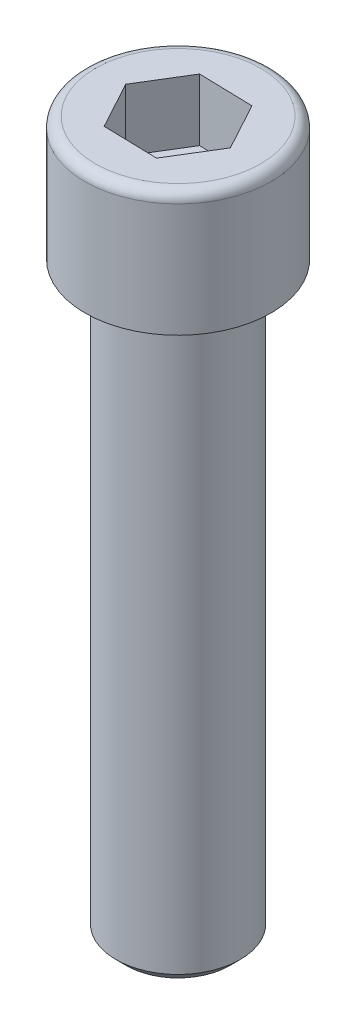
ISO-10303-21;
HEADER;
FILE_DESCRIPTION(('STEP AP214'),'2;1');
FILE_NAME('part.step','',(''),(''),'','','');
FILE_SCHEMA(('AUTOMOTIVE_DESIGN { 1 0 10303 214 1 1 1 1 }'));
ENDSEC;
DATA;
#1=APPLICATION_CONTEXT('core data for automotive mechanical design processes');
#2=APPLICATION_PROTOCOL_DEFINITION('international standard','automotive_design',2000,#1);
#3=PRODUCT_CONTEXT('',#1,'mechanical');
#4=PRODUCT('Part','Part','',(#3));
#5=PRODUCT_RELATED_PRODUCT_CATEGORY('part','',(#4));
#6=PRODUCT_DEFINITION_FORMATION('','',#4);
#7=PRODUCT_DEFINITION_CONTEXT('part definition',#1,'design');
#8=PRODUCT_DEFINITION('design','',#6,#7);
#9=PRODUCT_DEFINITION_SHAPE('','',#8);
#10=(LENGTH_UNIT() NAMED_UNIT(*) SI_UNIT(.MILLI.,.METRE.));
#11=(NAMED_UNIT(*) PLANE_ANGLE_UNIT() SI_UNIT($,.RADIAN.));
#12=(NAMED_UNIT(*) SI_UNIT($,.STERADIAN.) SOLID_ANGLE_UNIT());
#13=UNCERTAINTY_MEASURE_WITH_UNIT(LENGTH_MEASURE(1.E-05),#10,'distance_accuracy_value','');
#14=(GEOMETRIC_REPRESENTATION_CONTEXT(3) GLOBAL_UNCERTAINTY_ASSIGNED_CONTEXT((#13)) GLOBAL_UNIT_ASSIGNED_CONTEXT((#10,
#11,#12)) REPRESENTATION_CONTEXT('',''));
#15=CARTESIAN_POINT('',(0.,0.,0.));
#16=DIRECTION('',(0.,0.,1.));
#17=DIRECTION('',(1.,0.,0.));
#18=AXIS2_PLACEMENT_3D('',#15,#16,#17);
#19=CARTESIAN_POINT('',(0.,36.,0.));
#20=DIRECTION('',(0.,-1.,0.));
#21=DIRECTION('',(0.,0.,-1.));
#22=AXIS2_PLACEMENT_3D('',#19,#20,#21);
#23=CYLINDRICAL_SURFACE('',#22,27.);
#24=CARTESIAN_POINT('',(0.,33.,0.));
#25=DIRECTION('',(0.,1.,0.));
#26=DIRECTION('',(0.,0.,1.));
#27=AXIS2_PLACEMENT_3D('',#24,#25,#26);
#28=CIRCLE('',#27,27.);
#29=CARTESIAN_POINT('',(0.,33.,27.));
#30=VERTEX_POINT('',#29);
#31=EDGE_CURVE('E147',#30,#30,#28,.F.);
#32=ORIENTED_EDGE('',*,*,#31,.T.);
#33=EDGE_LOOP('',(#32));
#34=FACE_BOUND('',#33,.T.);
#35=CARTESIAN_POINT('',(0.,0.,0.));
#36=DIRECTION('',(0.,1.,0.));
#37=DIRECTION('',(0.,0.,1.));
#38=AXIS2_PLACEMENT_3D('',#35,#36,#37);
#39=CIRCLE('',#38,27.);
#40=CARTESIAN_POINT('',(0.,0.,27.));
#41=VERTEX_POINT('',#40);
#42=EDGE_CURVE('E138',#41,#41,#39,.T.);
#43=ORIENTED_EDGE('',*,*,#42,.T.);
#44=EDGE_LOOP('',(#43));
#45=FACE_BOUND('',#44,.T.);
#46=ADVANCED_FACE('F36',(#34,#45),#23,.T.);
#47=CARTESIAN_POINT('',(0.,36.,0.));
#48=DIRECTION('',(0.,1.,0.));
#49=DIRECTION('',(0.,0.,1.));
#50=AXIS2_PLACEMENT_3D('',#47,#48,#49);
#51=PLANE('',#50);
#52=DIRECTION('',(-0.477309128780898,0.,-0.878735452558061));
#53=VECTOR('',#52,1.);
#54=CARTESIAN_POINT('',(15.5831850883761,36.,0.405391787549548));
#55=LINE('',#54,#53);
#56=CARTESIAN_POINT('',(15.5831850883761,36.,0.405391787549548));
#57=VERTEX_POINT('',#56);
#58=CARTESIAN_POINT('',(8.14267213069154,36.,-13.2927382646338));
#59=VERTEX_POINT('',#58);
#60=EDGE_CURVE('E51',#57,#59,#55,.T.);
#61=ORIENTED_EDGE('',*,*,#60,.F.);
#62=DIRECTION('',(0.522352660730847,0.,-0.852729557261506));
#63=VECTOR('',#62,1.);
#64=CARTESIAN_POINT('',(7.44051295768457,36.,13.6981300521833));
#65=LINE('',#64,#63);
#66=CARTESIAN_POINT('',(7.44051295768457,36.,13.6981300521833));
#67=VERTEX_POINT('',#66);
#68=EDGE_CURVE('E134',#67,#57,#65,.T.);
#69=ORIENTED_EDGE('',*,*,#68,.F.);
#70=DIRECTION('',(0.999661789511745,0.,0.026005895296555));
#71=VECTOR('',#70,1.);
#72=CARTESIAN_POINT('',(-8.14267213069154,36.,13.2927382646338));
#73=LINE('',#72,#71);
#74=CARTESIAN_POINT('',(-8.14267213069154,36.,13.2927382646338));
#75=VERTEX_POINT('',#74);
#76=EDGE_CURVE('E132',#75,#67,#73,.T.);
#77=ORIENTED_EDGE('',*,*,#76,.F.);
#78=DIRECTION('',(0.477309128780898,0.,0.878735452558061));
#79=VECTOR('',#78,1.);
#80=CARTESIAN_POINT('',(-15.5831850883761,36.,-0.405391787549548));
#81=LINE('',#80,#79);
#82=CARTESIAN_POINT('',(-15.5831850883761,36.,-0.405391787549548));
#83=VERTEX_POINT('',#82);
#84=EDGE_CURVE('E99',#83,#75,#81,.T.);
#85=ORIENTED_EDGE('',*,*,#84,.F.);
#86=DIRECTION('',(-0.522352660730848,0.,0.852729557261506));
#87=VECTOR('',#86,1.);
#88=CARTESIAN_POINT('',(-7.44051295768456,36.,-13.6981300521833));
#89=LINE('',#88,#87);
#90=CARTESIAN_POINT('',(-7.44051295768456,36.,-13.6981300521833));
#91=VERTEX_POINT('',#90);
#92=EDGE_CURVE('E128',#91,#83,#89,.T.);
#93=ORIENTED_EDGE('',*,*,#92,.F.);
#94=DIRECTION('',(-0.999661789511745,0.,-0.0260058952965548));
#95=VECTOR('',#94,1.);
#96=CARTESIAN_POINT('',(8.14267213069154,36.,-13.2927382646338));
#97=LINE('',#96,#95);
#98=EDGE_CURVE('E125',#59,#91,#97,.T.);
#99=ORIENTED_EDGE('',*,*,#98,.F.);
#100=EDGE_LOOP('',(#61,#69,#77,#85,#93,#99));
#101=FACE_BOUND('',#100,.T.);
#102=CARTESIAN_POINT('',(0.,36.,0.));
#103=DIRECTION('',(0.,1.,0.));
#104=DIRECTION('',(0.,0.,1.));
#105=AXIS2_PLACEMENT_3D('',#102,#103,#104);
#106=CIRCLE('',#105,24.);
#107=CARTESIAN_POINT('',(0.,36.,24.));
#108=VERTEX_POINT('',#107);
#109=EDGE_CURVE('E150',#108,#108,#106,.T.);
#110=ORIENTED_EDGE('',*,*,#109,.T.);
#111=EDGE_LOOP('',(#110));
#112=FACE_BOUND('',#111,.T.);
#113=ADVANCED_FACE('F168',(#101,#112),#51,.T.);
#114=CARTESIAN_POINT('',(0.,0.,0.));
#115=DIRECTION('',(0.,1.,0.));
#116=DIRECTION('',(0.,0.,1.));
#117=AXIS2_PLACEMENT_3D('',#114,#115,#116);
#118=PLANE('',#117);
#119=CARTESIAN_POINT('',(0.,0.,0.));
#120=DIRECTION('',(0.,-1.,0.));
#121=DIRECTION('',(0.,0.,-1.));
#122=AXIS2_PLACEMENT_3D('',#119,#120,#121);
#123=CIRCLE('',#122,18.);
#124=CARTESIAN_POINT('',(0.,0.,-18.));
#125=VERTEX_POINT('',#124);
#126=EDGE_CURVE('E144',#125,#125,#123,.T.);
#127=ORIENTED_EDGE('',*,*,#126,.F.);
#128=EDGE_LOOP('',(#127));
#129=FACE_BOUND('',#128,.T.);
#130=ORIENTED_EDGE('',*,*,#42,.F.);
#131=EDGE_LOOP('',(#130));
#132=FACE_BOUND('',#131,.T.);
#133=ADVANCED_FACE('F174',(#129,#132),#118,.F.);
#134=CARTESIAN_POINT('',(0.,33.,0.));
#135=DIRECTION('',(0.,1.,0.));
#136=DIRECTION('',(0.,0.,1.));
#137=AXIS2_PLACEMENT_3D('',#134,#135,#136);
#138=TOROIDAL_SURFACE('',#137,24.,3.);
#139=ORIENTED_EDGE('',*,*,#31,.F.);
#140=EDGE_LOOP('',(#139));
#141=FACE_BOUND('',#140,.T.);
#142=ORIENTED_EDGE('',*,*,#109,.F.);
#143=EDGE_LOOP('',(#142));
#144=FACE_BOUND('',#143,.T.);
#145=ADVANCED_FACE('F179',(#141,#144),#138,.T.);
#146=CARTESIAN_POINT('',(0.,-170.,0.));
#147=DIRECTION('',(0.,1.,0.));
#148=DIRECTION('',(0.,0.,1.));
#149=AXIS2_PLACEMENT_3D('',#146,#147,#148);
#150=CYLINDRICAL_SURFACE('',#149,18.);
#151=CARTESIAN_POINT('',(0.,-167.,0.));
#152=DIRECTION('',(0.,-1.,0.));
#153=DIRECTION('',(0.,0.,-1.));
#154=AXIS2_PLACEMENT_3D('',#151,#152,#153);
#155=CIRCLE('',#154,18.);
#156=CARTESIAN_POINT('',(0.,-167.,-18.));
#157=VERTEX_POINT('',#156);
#158=EDGE_CURVE('E11',#157,#157,#155,.F.);
#159=ORIENTED_EDGE('',*,*,#158,.T.);
#160=EDGE_LOOP('',(#159));
#161=FACE_BOUND('',#160,.T.);
#162=ORIENTED_EDGE('',*,*,#126,.T.);
#163=EDGE_LOOP('',(#162));
#164=FACE_BOUND('',#163,.T.);
#165=ADVANCED_FACE('F181',(#161,#164),#150,.T.);
#166=CARTESIAN_POINT('',(0.,-170.,0.));
#167=DIRECTION('',(0.,-1.,0.));
#168=DIRECTION('',(0.,0.,-1.));
#169=AXIS2_PLACEMENT_3D('',#166,#167,#168);
#170=PLANE('',#169);
#171=CARTESIAN_POINT('',(0.,-170.,0.));
#172=DIRECTION('',(0.,-1.,0.));
#173=DIRECTION('',(0.,0.,-1.));
#174=AXIS2_PLACEMENT_3D('',#171,#172,#173);
#175=CIRCLE('',#174,15.);
#176=CARTESIAN_POINT('',(0.,-170.,-15.));
#177=VERTEX_POINT('',#176);
#178=EDGE_CURVE('E44',#177,#177,#175,.T.);
#179=ORIENTED_EDGE('',*,*,#178,.T.);
#180=EDGE_LOOP('',(#179));
#181=FACE_BOUND('',#180,.T.);
#182=ADVANCED_FACE('F157',(#181),#170,.T.);
#183=CARTESIAN_POINT('',(15.5831850883761,18.,0.405391787549548));
#184=DIRECTION('',(0.878735452558061,0.,-0.477309128780898));
#185=DIRECTION('',(-0.477309128780898,0.,-0.878735452558061));
#186=AXIS2_PLACEMENT_3D('',#183,#184,#185);
#187=PLANE('',#186);
#188=ORIENTED_EDGE('',*,*,#60,.T.);
#189=DIRECTION('',(0.,1.,0.));
#190=VECTOR('',#189,1.);
#191=CARTESIAN_POINT('',(8.14267213069154,18.,-13.2927382646338));
#192=LINE('',#191,#190);
#193=CARTESIAN_POINT('',(8.14267213069154,18.,-13.2927382646338));
#194=VERTEX_POINT('',#193);
#195=EDGE_CURVE('E81',#194,#59,#192,.T.);
#196=ORIENTED_EDGE('',*,*,#195,.F.);
#197=DIRECTION('',(-0.477309128780898,0.,-0.878735452558061));
#198=VECTOR('',#197,1.);
#199=CARTESIAN_POINT('',(15.5831850883761,18.,0.405391787549548));
#200=LINE('',#199,#198);
#201=CARTESIAN_POINT('',(15.5831850883761,18.,0.405391787549548));
#202=VERTEX_POINT('',#201);
#203=EDGE_CURVE('E136',#202,#194,#200,.T.);
#204=ORIENTED_EDGE('',*,*,#203,.F.);
#205=DIRECTION('',(0.,1.,0.));
#206=VECTOR('',#205,1.);
#207=CARTESIAN_POINT('',(15.5831850883761,18.,0.405391787549548));
#208=LINE('',#207,#206);
#209=EDGE_CURVE('E59',#202,#57,#208,.T.);
#210=ORIENTED_EDGE('',*,*,#209,.T.);
#211=EDGE_LOOP('',(#188,#196,#204,#210));
#212=FACE_BOUND('',#211,.T.);
#213=ADVANCED_FACE('F210',(#212),#187,.F.);
#214=CARTESIAN_POINT('',(7.44051295768457,18.,13.6981300521833));
#215=DIRECTION('',(0.852729557261506,0.,0.522352660730847));
#216=DIRECTION('',(0.522352660730847,0.,-0.852729557261506));
#217=AXIS2_PLACEMENT_3D('',#214,#215,#216);
#218=PLANE('',#217);
#219=ORIENTED_EDGE('',*,*,#68,.T.);
#220=ORIENTED_EDGE('',*,*,#209,.F.);
#221=DIRECTION('',(0.522352660730847,0.,-0.852729557261506));
#222=VECTOR('',#221,1.);
#223=CARTESIAN_POINT('',(7.44051295768457,18.,13.6981300521833));
#224=LINE('',#223,#222);
#225=CARTESIAN_POINT('',(7.44051295768457,18.,13.6981300521833));
#226=VERTEX_POINT('',#225);
#227=EDGE_CURVE('E111',#226,#202,#224,.T.);
#228=ORIENTED_EDGE('',*,*,#227,.F.);
#229=DIRECTION('',(0.,1.,0.));
#230=VECTOR('',#229,1.);
#231=CARTESIAN_POINT('',(7.44051295768457,18.,13.6981300521833));
#232=LINE('',#231,#230);
#233=EDGE_CURVE('E103',#226,#67,#232,.T.);
#234=ORIENTED_EDGE('',*,*,#233,.T.);
#235=EDGE_LOOP('',(#219,#220,#228,#234));
#236=FACE_BOUND('',#235,.T.);
#237=ADVANCED_FACE('F215',(#236),#218,.F.);
#238=CARTESIAN_POINT('',(-8.14267213069154,18.,13.2927382646338));
#239=DIRECTION('',(-0.026005895296555,0.,0.999661789511745));
#240=DIRECTION('',(0.999661789511745,0.,0.026005895296555));
#241=AXIS2_PLACEMENT_3D('',#238,#239,#240);
#242=PLANE('',#241);
#243=ORIENTED_EDGE('',*,*,#76,.T.);
#244=ORIENTED_EDGE('',*,*,#233,.F.);
#245=DIRECTION('',(0.999661789511745,0.,0.026005895296555));
#246=VECTOR('',#245,1.);
#247=CARTESIAN_POINT('',(-8.14267213069154,18.,13.2927382646338));
#248=LINE('',#247,#246);
#249=CARTESIAN_POINT('',(-8.14267213069154,18.,13.2927382646338));
#250=VERTEX_POINT('',#249);
#251=EDGE_CURVE('E107',#250,#226,#248,.T.);
#252=ORIENTED_EDGE('',*,*,#251,.F.);
#253=DIRECTION('',(0.,1.,0.));
#254=VECTOR('',#253,1.);
#255=CARTESIAN_POINT('',(-8.14267213069154,18.,13.2927382646338));
#256=LINE('',#255,#254);
#257=EDGE_CURVE('E92',#250,#75,#256,.T.);
#258=ORIENTED_EDGE('',*,*,#257,.T.);
#259=EDGE_LOOP('',(#243,#244,#252,#258));
#260=FACE_BOUND('',#259,.T.);
#261=ADVANCED_FACE('F108',(#260),#242,.F.);
#262=CARTESIAN_POINT('',(-15.5831850883761,18.,-0.405391787549548));
#263=DIRECTION('',(-0.878735452558061,0.,0.477309128780898));
#264=DIRECTION('',(0.477309128780898,0.,0.878735452558061));
#265=AXIS2_PLACEMENT_3D('',#262,#263,#264);
#266=PLANE('',#265);
#267=ORIENTED_EDGE('',*,*,#84,.T.);
#268=ORIENTED_EDGE('',*,*,#257,.F.);
#269=DIRECTION('',(0.477309128780898,0.,0.878735452558061));
#270=VECTOR('',#269,1.);
#271=CARTESIAN_POINT('',(-15.5831850883761,18.,-0.405391787549548));
#272=LINE('',#271,#270);
#273=CARTESIAN_POINT('',(-15.5831850883761,18.,-0.405391787549548));
#274=VERTEX_POINT('',#273);
#275=EDGE_CURVE('E96',#274,#250,#272,.T.);
#276=ORIENTED_EDGE('',*,*,#275,.F.);
#277=DIRECTION('',(0.,1.,0.));
#278=VECTOR('',#277,1.);
#279=CARTESIAN_POINT('',(-15.5831850883761,18.,-0.405391787549548));
#280=LINE('',#279,#278);
#281=EDGE_CURVE('E104',#274,#83,#280,.T.);
#282=ORIENTED_EDGE('',*,*,#281,.T.);
#283=EDGE_LOOP('',(#267,#268,#276,#282));
#284=FACE_BOUND('',#283,.T.);
#285=ADVANCED_FACE('F94',(#284),#266,.F.);
#286=CARTESIAN_POINT('',(-7.44051295768456,18.,-13.6981300521833));
#287=DIRECTION('',(-0.852729557261506,0.,-0.522352660730848));
#288=DIRECTION('',(-0.522352660730848,0.,0.852729557261506));
#289=AXIS2_PLACEMENT_3D('',#286,#287,#288);
#290=PLANE('',#289);
#291=ORIENTED_EDGE('',*,*,#92,.T.);
#292=ORIENTED_EDGE('',*,*,#281,.F.);
#293=DIRECTION('',(-0.522352660730848,0.,0.852729557261506));
#294=VECTOR('',#293,1.);
#295=CARTESIAN_POINT('',(-7.44051295768456,18.,-13.6981300521833));
#296=LINE('',#295,#294);
#297=CARTESIAN_POINT('',(-7.44051295768456,18.,-13.6981300521833));
#298=VERTEX_POINT('',#297);
#299=EDGE_CURVE('E117',#298,#274,#296,.T.);
#300=ORIENTED_EDGE('',*,*,#299,.F.);
#301=DIRECTION('',(0.,1.,0.));
#302=VECTOR('',#301,1.);
#303=CARTESIAN_POINT('',(-7.44051295768456,18.,-13.6981300521833));
#304=LINE('',#303,#302);
#305=EDGE_CURVE('E141',#298,#91,#304,.T.);
#306=ORIENTED_EDGE('',*,*,#305,.T.);
#307=EDGE_LOOP('',(#291,#292,#300,#306));
#308=FACE_BOUND('',#307,.T.);
#309=ADVANCED_FACE('F242',(#308),#290,.F.);
#310=CARTESIAN_POINT('',(8.14267213069154,18.,-13.2927382646338));
#311=DIRECTION('',(0.0260058952965548,0.,-0.999661789511745));
#312=DIRECTION('',(-0.999661789511745,0.,-0.0260058952965548));
#313=AXIS2_PLACEMENT_3D('',#310,#311,#312);
#314=PLANE('',#313);
#315=ORIENTED_EDGE('',*,*,#98,.T.);
#316=ORIENTED_EDGE('',*,*,#305,.F.);
#317=DIRECTION('',(-0.999661789511745,0.,-0.0260058952965548));
#318=VECTOR('',#317,1.);
#319=CARTESIAN_POINT('',(8.14267213069154,18.,-13.2927382646338));
#320=LINE('',#319,#318);
#321=EDGE_CURVE('E119',#194,#298,#320,.T.);
#322=ORIENTED_EDGE('',*,*,#321,.F.);
#323=ORIENTED_EDGE('',*,*,#195,.T.);
#324=EDGE_LOOP('',(#315,#316,#322,#323));
#325=FACE_BOUND('',#324,.T.);
#326=ADVANCED_FACE('F164',(#325),#314,.F.);
#327=CARTESIAN_POINT('',(0.,18.,0.));
#328=DIRECTION('',(0.,1.,0.));
#329=DIRECTION('',(0.,0.,1.));
#330=AXIS2_PLACEMENT_3D('',#327,#328,#329);
#331=PLANE('',#330);
#332=ORIENTED_EDGE('',*,*,#203,.T.);
#333=ORIENTED_EDGE('',*,*,#321,.T.);
#334=ORIENTED_EDGE('',*,*,#299,.T.);
#335=ORIENTED_EDGE('',*,*,#275,.T.);
#336=ORIENTED_EDGE('',*,*,#251,.T.);
#337=ORIENTED_EDGE('',*,*,#227,.T.);
#338=EDGE_LOOP('',(#332,#333,#334,#335,#336,#337));
#339=FACE_BOUND('',#338,.T.);
#340=ADVANCED_FACE('F114',(#339),#331,.T.);
#341=CARTESIAN_POINT('',(0.,-170.,0.));
#342=DIRECTION('',(0.,1.,0.));
#343=DIRECTION('',(0.,0.,1.));
#344=AXIS2_PLACEMENT_3D('',#341,#342,#343);
#345=CONICAL_SURFACE('',#344,15.,0.78539816339745);
#346=ORIENTED_EDGE('',*,*,#158,.F.);
#347=EDGE_LOOP('',(#346));
#348=FACE_BOUND('',#347,.T.);
#349=ORIENTED_EDGE('',*,*,#178,.F.);
#350=EDGE_LOOP('',(#349));
#351=FACE_BOUND('',#350,.T.);
#352=ADVANCED_FACE('F38',(#348,#351),#345,.T.);
#353=CLOSED_SHELL('',(#46,#113,#133,#145,#165,#182,#213,#237,#261,#285,#309,#326,#340,#352));
#354=MANIFOLD_SOLID_BREP('B2',#353);
#355=ADVANCED_BREP_SHAPE_REPRESENTATION('',(#18,#354),#14);
#356=SHAPE_DEFINITION_REPRESENTATION(#9,#355);
ENDSEC;
END-ISO-10303-21;
